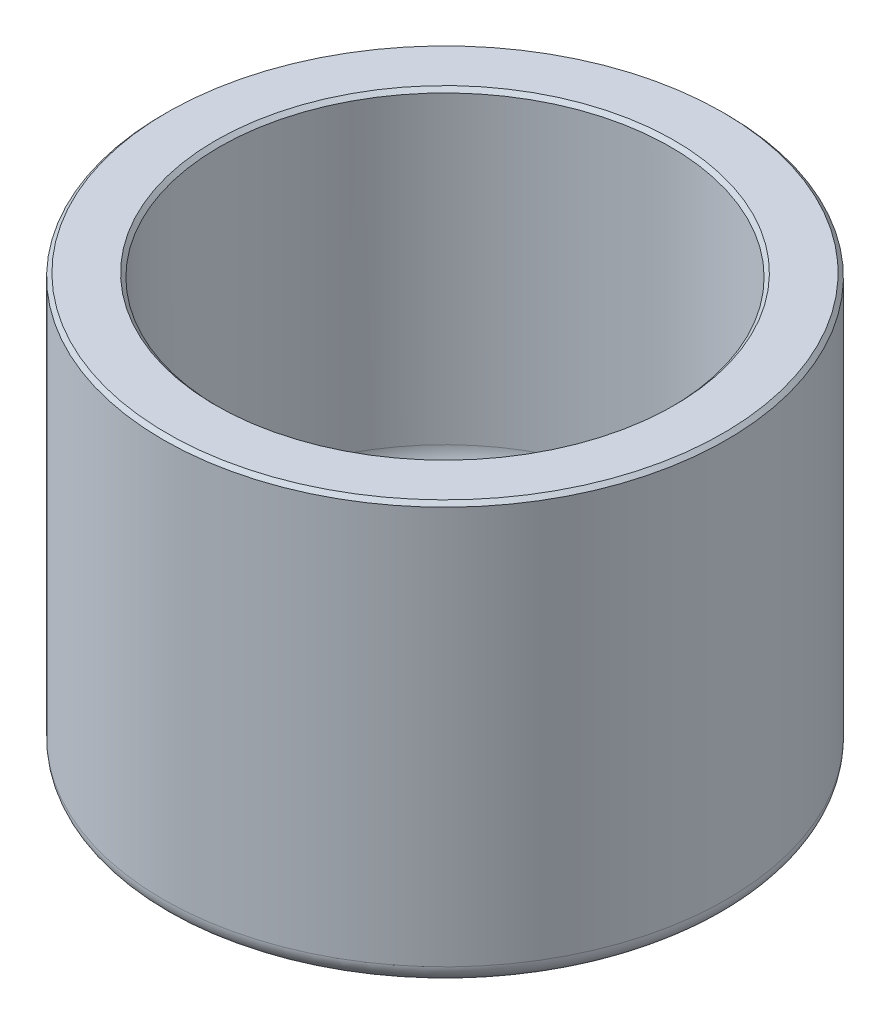
ISO-10303-21;
HEADER;
FILE_DESCRIPTION(('STEP AP214'),'2;1');
FILE_NAME('part.step','',(''),(''),'','','');
FILE_SCHEMA(('AUTOMOTIVE_DESIGN { 1 0 10303 214 1 1 1 1 }'));
ENDSEC;
DATA;
#1=APPLICATION_CONTEXT('core data for automotive mechanical design processes');
#2=APPLICATION_PROTOCOL_DEFINITION('international standard','automotive_design',2000,#1);
#3=PRODUCT_CONTEXT('',#1,'mechanical');
#4=PRODUCT('Part','Part','',(#3));
#5=PRODUCT_RELATED_PRODUCT_CATEGORY('part','',(#4));
#6=PRODUCT_DEFINITION_FORMATION('','',#4);
#7=PRODUCT_DEFINITION_CONTEXT('part definition',#1,'design');
#8=PRODUCT_DEFINITION('design','',#6,#7);
#9=PRODUCT_DEFINITION_SHAPE('','',#8);
#10=(LENGTH_UNIT() NAMED_UNIT(*) SI_UNIT(.MILLI.,.METRE.));
#11=(NAMED_UNIT(*) PLANE_ANGLE_UNIT() SI_UNIT($,.RADIAN.));
#12=(NAMED_UNIT(*) SI_UNIT($,.STERADIAN.) SOLID_ANGLE_UNIT());
#13=UNCERTAINTY_MEASURE_WITH_UNIT(LENGTH_MEASURE(1.E-05),#10,'distance_accuracy_value','');
#14=(GEOMETRIC_REPRESENTATION_CONTEXT(3) GLOBAL_UNCERTAINTY_ASSIGNED_CONTEXT((#13)) GLOBAL_UNIT_ASSIGNED_CONTEXT((#10,
#11,#12)) REPRESENTATION_CONTEXT('',''));
#15=CARTESIAN_POINT('',(0.,0.,0.));
#16=DIRECTION('',(0.,0.,1.));
#17=DIRECTION('',(1.,0.,0.));
#18=AXIS2_PLACEMENT_3D('',#15,#16,#17);
#19=CARTESIAN_POINT('',(-12.075,4.,0.));
#20=DIRECTION('',(0.,1.,0.));
#21=DIRECTION('',(0.,0.,1.));
#22=AXIS2_PLACEMENT_3D('',#19,#20,#21);
#23=PLANE('',#22);
#24=CARTESIAN_POINT('',(0.,4.,0.));
#25=DIRECTION('',(0.,-1.,0.));
#26=DIRECTION('',(0.,0.,-1.));
#27=AXIS2_PLACEMENT_3D('',#24,#25,#26);
#28=CIRCLE('',#27,10.075);
#29=CARTESIAN_POINT('',(0.,4.,10.075));
#30=VERTEX_POINT('',#29);
#31=CARTESIAN_POINT('',(0.,4.,-10.075));
#32=VERTEX_POINT('',#31);
#33=EDGE_CURVE('E48',#30,#32,#28,.F.);
#34=ORIENTED_EDGE('',*,*,#33,.T.);
#35=CARTESIAN_POINT('',(0.,4.,0.));
#36=DIRECTION('',(0.,-1.,0.));
#37=DIRECTION('',(0.,0.,1.));
#38=AXIS2_PLACEMENT_3D('',#35,#36,#37);
#39=CIRCLE('',#38,10.075);
#40=EDGE_CURVE('E45',#32,#30,#39,.F.);
#41=ORIENTED_EDGE('',*,*,#40,.T.);
#42=EDGE_LOOP('',(#34,#41));
#43=FACE_BOUND('',#42,.T.);
#44=ADVANCED_FACE('F17',(#43),#23,.T.);
#45=CARTESIAN_POINT('',(0.,6.,0.));
#46=DIRECTION('',(0.,1.,0.));
#47=DIRECTION('',(0.,0.,1.));
#48=AXIS2_PLACEMENT_3D('',#45,#46,#47);
#49=TOROIDAL_SURFACE('',#48,10.075,2.);
#50=ORIENTED_EDGE('',*,*,#33,.F.);
#51=ORIENTED_EDGE('',*,*,#40,.F.);
#52=EDGE_LOOP('',(#50,#51));
#53=FACE_BOUND('',#52,.T.);
#54=CARTESIAN_POINT('',(0.,6.,0.));
#55=DIRECTION('',(0.,1.,0.));
#56=DIRECTION('',(0.,0.,1.));
#57=AXIS2_PLACEMENT_3D('',#54,#55,#56);
#58=CIRCLE('',#57,12.075);
#59=CARTESIAN_POINT('',(0.,6.,12.075));
#60=VERTEX_POINT('',#59);
#61=EDGE_CURVE('E52',#60,#60,#58,.T.);
#62=ORIENTED_EDGE('',*,*,#61,.T.);
#63=EDGE_LOOP('',(#62));
#64=FACE_BOUND('',#63,.T.);
#65=ADVANCED_FACE('F55',(#53,#64),#49,.F.);
#66=CARTESIAN_POINT('',(0.,4.,0.));
#67=DIRECTION('',(0.,1.,0.));
#68=DIRECTION('',(0.,0.,1.));
#69=AXIS2_PLACEMENT_3D('',#66,#67,#68);
#70=CYLINDRICAL_SURFACE('',#69,12.075);
#71=ORIENTED_EDGE('',*,*,#61,.F.);
#72=EDGE_LOOP('',(#71));
#73=FACE_BOUND('',#72,.T.);
#74=CARTESIAN_POINT('',(0.,22.3,0.));
#75=DIRECTION('',(0.,1.,0.));
#76=DIRECTION('',(0.,0.,1.));
#77=AXIS2_PLACEMENT_3D('',#74,#75,#76);
#78=CIRCLE('',#77,12.075);
#79=CARTESIAN_POINT('',(0.,22.3,12.075));
#80=VERTEX_POINT('',#79);
#81=EDGE_CURVE('E119',#80,#80,#78,.T.);
#82=ORIENTED_EDGE('',*,*,#81,.T.);
#83=EDGE_LOOP('',(#82));
#84=FACE_BOUND('',#83,.T.);
#85=ADVANCED_FACE('F127',(#73,#84),#70,.F.);
#86=CARTESIAN_POINT('',(0.,22.5,0.));
#87=DIRECTION('',(0.,1.,0.));
#88=DIRECTION('',(-1.,0.,0.));
#89=AXIS2_PLACEMENT_3D('',#86,#87,#88);
#90=CONICAL_SURFACE('',#89,12.275,0.785398163397448);
#91=ORIENTED_EDGE('',*,*,#81,.F.);
#92=EDGE_LOOP('',(#91));
#93=FACE_BOUND('',#92,.T.);
#94=CARTESIAN_POINT('',(0.,22.5,0.));
#95=DIRECTION('',(0.,1.,0.));
#96=DIRECTION('',(-1.,0.,0.));
#97=AXIS2_PLACEMENT_3D('',#94,#95,#96);
#98=CIRCLE('',#97,12.275);
#99=CARTESIAN_POINT('',(-12.275,22.5,0.));
#100=VERTEX_POINT('',#99);
#101=EDGE_CURVE('E122',#100,#100,#98,.F.);
#102=ORIENTED_EDGE('',*,*,#101,.F.);
#103=EDGE_LOOP('',(#102));
#104=FACE_BOUND('',#103,.T.);
#105=ADVANCED_FACE('F97',(#93,#104),#90,.F.);
#106=CARTESIAN_POINT('',(0.,0.,0.));
#107=DIRECTION('',(0.,-1.,0.));
#108=DIRECTION('',(0.,0.,-1.));
#109=AXIS2_PLACEMENT_3D('',#106,#107,#108);
#110=PLANE('',#109);
#111=CARTESIAN_POINT('',(0.,0.,0.));
#112=DIRECTION('',(0.,1.,0.));
#113=DIRECTION('',(0.,0.,1.));
#114=AXIS2_PLACEMENT_3D('',#111,#112,#113);
#115=CIRCLE('',#114,14.075);
#116=CARTESIAN_POINT('',(0.,0.,14.075));
#117=VERTEX_POINT('',#116);
#118=CARTESIAN_POINT('',(0.,0.,-14.075));
#119=VERTEX_POINT('',#118);
#120=EDGE_CURVE('E84',#117,#119,#115,.T.);
#121=ORIENTED_EDGE('',*,*,#120,.F.);
#122=CARTESIAN_POINT('',(0.,0.,0.));
#123=DIRECTION('',(0.,1.,0.));
#124=DIRECTION('',(0.,0.,-1.));
#125=AXIS2_PLACEMENT_3D('',#122,#123,#124);
#126=CIRCLE('',#125,14.075);
#127=EDGE_CURVE('E36',#119,#117,#126,.T.);
#128=ORIENTED_EDGE('',*,*,#127,.F.);
#129=EDGE_LOOP('',(#121,#128));
#130=FACE_BOUND('',#129,.T.);
#131=ADVANCED_FACE('F88',(#130),#110,.T.);
#132=CARTESIAN_POINT('',(-15.075,22.5,0.));
#133=DIRECTION('',(0.,1.,0.));
#134=DIRECTION('',(0.,0.,1.));
#135=AXIS2_PLACEMENT_3D('',#132,#133,#134);
#136=PLANE('',#135);
#137=CARTESIAN_POINT('',(0.,22.5,0.));
#138=DIRECTION('',(0.,-1.,0.));
#139=DIRECTION('',(0.,0.,-1.));
#140=AXIS2_PLACEMENT_3D('',#137,#138,#139);
#141=CIRCLE('',#140,14.875);
#142=CARTESIAN_POINT('',(0.,22.5,-14.875));
#143=VERTEX_POINT('',#142);
#144=EDGE_CURVE('E118',#143,#143,#141,.T.);
#145=ORIENTED_EDGE('',*,*,#144,.F.);
#146=EDGE_LOOP('',(#145));
#147=FACE_BOUND('',#146,.T.);
#148=ORIENTED_EDGE('',*,*,#101,.T.);
#149=EDGE_LOOP('',(#148));
#150=FACE_BOUND('',#149,.T.);
#151=ADVANCED_FACE('F75',(#147,#150),#136,.T.);
#152=CARTESIAN_POINT('',(0.,0.999999999999999,0.));
#153=DIRECTION('',(0.,-1.,0.));
#154=DIRECTION('',(0.,0.,-1.));
#155=AXIS2_PLACEMENT_3D('',#152,#153,#154);
#156=TOROIDAL_SURFACE('',#155,14.075,1.);
#157=ORIENTED_EDGE('',*,*,#127,.T.);
#158=ORIENTED_EDGE('',*,*,#120,.T.);
#159=EDGE_LOOP('',(#157,#158));
#160=FACE_BOUND('',#159,.T.);
#161=CARTESIAN_POINT('',(0.,0.999999999999999,0.));
#162=DIRECTION('',(0.,1.,0.));
#163=DIRECTION('',(0.,0.,1.));
#164=AXIS2_PLACEMENT_3D('',#161,#162,#163);
#165=CIRCLE('',#164,15.075);
#166=CARTESIAN_POINT('',(0.,0.999999999999999,15.075));
#167=VERTEX_POINT('',#166);
#168=EDGE_CURVE('E28',#167,#167,#165,.T.);
#169=ORIENTED_EDGE('',*,*,#168,.F.);
#170=EDGE_LOOP('',(#169));
#171=FACE_BOUND('',#170,.T.);
#172=ADVANCED_FACE('F63',(#160,#171),#156,.T.);
#173=CARTESIAN_POINT('',(0.,22.3,0.));
#174=DIRECTION('',(0.,-1.,0.));
#175=DIRECTION('',(0.,0.,-1.));
#176=AXIS2_PLACEMENT_3D('',#173,#174,#175);
#177=CONICAL_SURFACE('',#176,15.075,0.785398163397431);
#178=CARTESIAN_POINT('',(0.,22.3,0.));
#179=DIRECTION('',(0.,1.,0.));
#180=DIRECTION('',(0.,0.,1.));
#181=AXIS2_PLACEMENT_3D('',#178,#179,#180);
#182=CIRCLE('',#181,15.075);
#183=CARTESIAN_POINT('',(0.,22.3,15.075));
#184=VERTEX_POINT('',#183);
#185=EDGE_CURVE('E11',#184,#184,#182,.F.);
#186=ORIENTED_EDGE('',*,*,#185,.F.);
#187=EDGE_LOOP('',(#186));
#188=FACE_BOUND('',#187,.T.);
#189=ORIENTED_EDGE('',*,*,#144,.T.);
#190=EDGE_LOOP('',(#189));
#191=FACE_BOUND('',#190,.T.);
#192=ADVANCED_FACE('F74',(#188,#191),#177,.T.);
#193=CARTESIAN_POINT('',(0.,4.,0.));
#194=DIRECTION('',(0.,1.,0.));
#195=DIRECTION('',(0.,0.,1.));
#196=AXIS2_PLACEMENT_3D('',#193,#194,#195);
#197=CYLINDRICAL_SURFACE('',#196,15.075);
#198=ORIENTED_EDGE('',*,*,#185,.T.);
#199=EDGE_LOOP('',(#198));
#200=FACE_BOUND('',#199,.T.);
#201=ORIENTED_EDGE('',*,*,#168,.T.);
#202=EDGE_LOOP('',(#201));
#203=FACE_BOUND('',#202,.T.);
#204=ADVANCED_FACE('F146',(#200,#203),#197,.T.);
#205=CLOSED_SHELL('',(#44,#65,#85,#105,#131,#151,#172,#192,#204));
#206=MANIFOLD_SOLID_BREP('B1',#205);
#207=ADVANCED_BREP_SHAPE_REPRESENTATION('',(#18,#206),#14);
#208=SHAPE_DEFINITION_REPRESENTATION(#9,#207);
ENDSEC;
END-ISO-10303-21;
